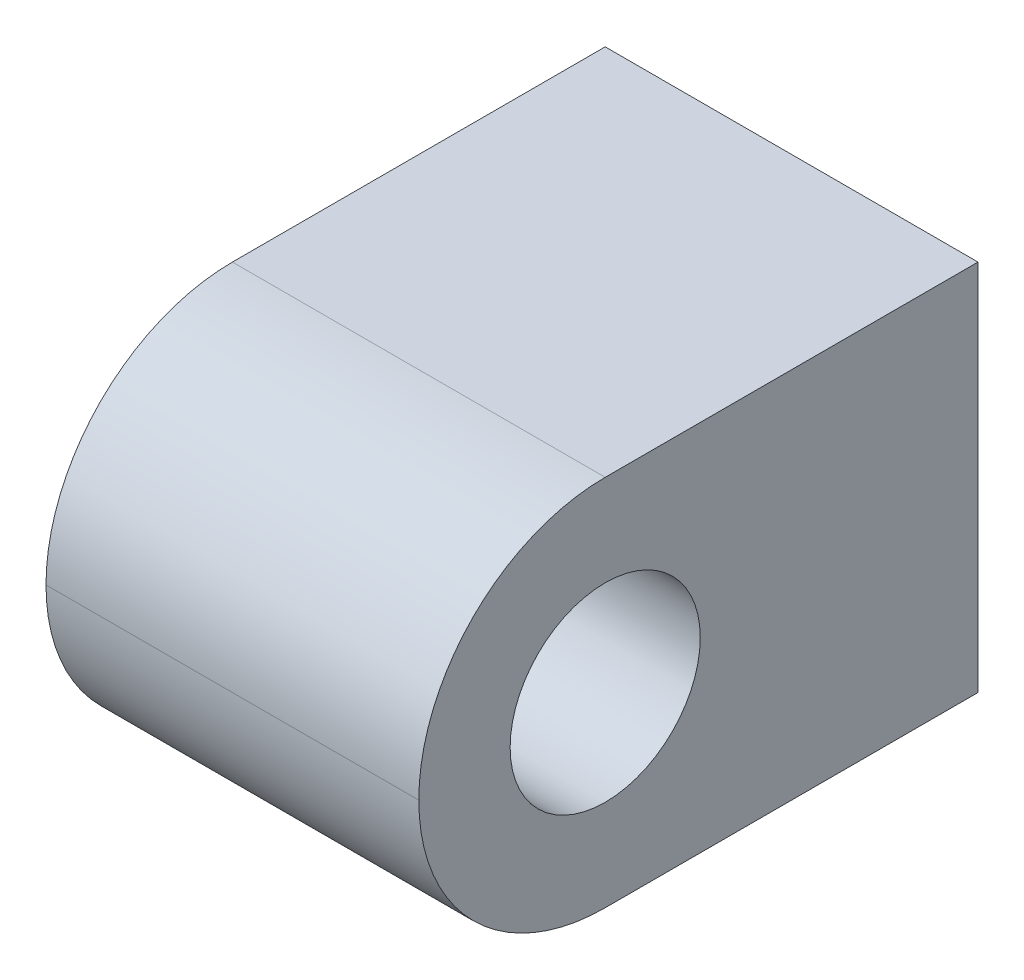
ISO-10303-21;
HEADER;
FILE_DESCRIPTION(('STEP AP214'),'2;1');
FILE_NAME('part.step','',(''),(''),'','','');
FILE_SCHEMA(('AUTOMOTIVE_DESIGN { 1 0 10303 214 1 1 1 1 }'));
ENDSEC;
DATA;
#1=APPLICATION_CONTEXT('core data for automotive mechanical design processes');
#2=APPLICATION_PROTOCOL_DEFINITION('international standard','automotive_design',2000,#1);
#3=PRODUCT_CONTEXT('',#1,'mechanical');
#4=PRODUCT('Part','Part','',(#3));
#5=PRODUCT_RELATED_PRODUCT_CATEGORY('part','',(#4));
#6=PRODUCT_DEFINITION_FORMATION('','',#4);
#7=PRODUCT_DEFINITION_CONTEXT('part definition',#1,'design');
#8=PRODUCT_DEFINITION('design','',#6,#7);
#9=PRODUCT_DEFINITION_SHAPE('','',#8);
#10=(LENGTH_UNIT() NAMED_UNIT(*) SI_UNIT(.MILLI.,.METRE.));
#11=(NAMED_UNIT(*) PLANE_ANGLE_UNIT() SI_UNIT($,.RADIAN.));
#12=(NAMED_UNIT(*) SI_UNIT($,.STERADIAN.) SOLID_ANGLE_UNIT());
#13=UNCERTAINTY_MEASURE_WITH_UNIT(LENGTH_MEASURE(1.E-05),#10,'distance_accuracy_value','');
#14=(GEOMETRIC_REPRESENTATION_CONTEXT(3) GLOBAL_UNCERTAINTY_ASSIGNED_CONTEXT((#13)) GLOBAL_UNIT_ASSIGNED_CONTEXT((#10,
#11,#12)) REPRESENTATION_CONTEXT('',''));
#15=CARTESIAN_POINT('',(0.,0.,0.));
#16=DIRECTION('',(0.,0.,1.));
#17=DIRECTION('',(1.,0.,0.));
#18=AXIS2_PLACEMENT_3D('',#15,#16,#17);
#19=CARTESIAN_POINT('',(0.,0.,0.));
#20=DIRECTION('',(0.,0.,1.));
#21=DIRECTION('',(1.,0.,0.));
#22=AXIS2_PLACEMENT_3D('',#19,#20,#21);
#23=PLANE('',#22);
#24=CARTESIAN_POINT('',(0.,0.,0.));
#25=DIRECTION('',(0.,0.,1.));
#26=DIRECTION('',(1.,0.,0.));
#27=AXIS2_PLACEMENT_3D('',#24,#25,#26);
#28=CIRCLE('',#27,2.475);
#29=CARTESIAN_POINT('',(2.475,0.,0.));
#30=VERTEX_POINT('',#29);
#31=EDGE_CURVE('E269',#30,#30,#28,.T.);
#32=ORIENTED_EDGE('',*,*,#31,.T.);
#33=EDGE_LOOP('',(#32));
#34=FACE_BOUND('',#33,.T.);
#35=DIRECTION('',(1.,0.,0.));
#36=VECTOR('',#35,1.);
#37=CARTESIAN_POINT('',(0.,-5.,0.));
#38=LINE('',#37,#36);
#39=CARTESIAN_POINT('',(-5.,-5.,0.));
#40=VERTEX_POINT('',#39);
#41=CARTESIAN_POINT('',(5.,-5.,0.));
#42=VERTEX_POINT('',#41);
#43=EDGE_CURVE('E156',#40,#42,#38,.T.);
#44=ORIENTED_EDGE('',*,*,#43,.F.);
#45=DIRECTION('',(0.,1.,0.));
#46=VECTOR('',#45,1.);
#47=CARTESIAN_POINT('',(-5.,0.,0.));
#48=LINE('',#47,#46);
#49=CARTESIAN_POINT('',(-5.,5.,0.));
#50=VERTEX_POINT('',#49);
#51=EDGE_CURVE('E171',#40,#50,#48,.T.);
#52=ORIENTED_EDGE('',*,*,#51,.T.);
#53=DIRECTION('',(1.,0.,0.));
#54=VECTOR('',#53,1.);
#55=CARTESIAN_POINT('',(0.,5.,0.));
#56=LINE('',#55,#54);
#57=CARTESIAN_POINT('',(5.,5.,0.));
#58=VERTEX_POINT('',#57);
#59=EDGE_CURVE('E159',#50,#58,#56,.T.);
#60=ORIENTED_EDGE('',*,*,#59,.T.);
#61=DIRECTION('',(0.,1.,0.));
#62=VECTOR('',#61,1.);
#63=CARTESIAN_POINT('',(5.,0.,0.));
#64=LINE('',#63,#62);
#65=EDGE_CURVE('E142',#42,#58,#64,.T.);
#66=ORIENTED_EDGE('',*,*,#65,.F.);
#67=EDGE_LOOP('',(#44,#52,#60,#66));
#68=FACE_BOUND('',#67,.T.);
#69=ADVANCED_FACE('F94',(#34,#68),#23,.F.);
#70=CARTESIAN_POINT('',(5.,0.,15.));
#71=DIRECTION('',(-1.,0.,0.));
#72=DIRECTION('',(0.,0.,1.));
#73=AXIS2_PLACEMENT_3D('',#70,#71,#72);
#74=PLANE('',#73);
#75=CARTESIAN_POINT('',(5.,0.,10.));
#76=DIRECTION('',(-1.,0.,0.));
#77=DIRECTION('',(0.,0.,1.));
#78=AXIS2_PLACEMENT_3D('',#75,#76,#77);
#79=CIRCLE('',#78,2.55);
#80=CARTESIAN_POINT('',(5.,0.,12.55));
#81=VERTEX_POINT('',#80);
#82=EDGE_CURVE('E163',#81,#81,#79,.T.);
#83=ORIENTED_EDGE('',*,*,#82,.T.);
#84=EDGE_LOOP('',(#83));
#85=FACE_BOUND('',#84,.T.);
#86=CARTESIAN_POINT('',(5.,0.,10.));
#87=DIRECTION('',(-1.,0.,0.));
#88=DIRECTION('',(0.,0.,1.));
#89=AXIS2_PLACEMENT_3D('',#86,#87,#88);
#90=CIRCLE('',#89,5.);
#91=CARTESIAN_POINT('',(5.,5.,10.));
#92=VERTEX_POINT('',#91);
#93=CARTESIAN_POINT('',(5.,0.,15.));
#94=VERTEX_POINT('',#93);
#95=EDGE_CURVE('E150',#92,#94,#90,.F.);
#96=ORIENTED_EDGE('',*,*,#95,.T.);
#97=CARTESIAN_POINT('',(5.,0.,10.));
#98=DIRECTION('',(-1.,0.,0.));
#99=DIRECTION('',(0.,0.,1.));
#100=AXIS2_PLACEMENT_3D('',#97,#98,#99);
#101=CIRCLE('',#100,5.);
#102=CARTESIAN_POINT('',(5.,-5.,10.));
#103=VERTEX_POINT('',#102);
#104=EDGE_CURVE('E145',#94,#103,#101,.F.);
#105=ORIENTED_EDGE('',*,*,#104,.T.);
#106=DIRECTION('',(0.,0.,-1.));
#107=VECTOR('',#106,1.);
#108=CARTESIAN_POINT('',(5.,-5.,15.));
#109=LINE('',#108,#107);
#110=EDGE_CURVE('E138',#103,#42,#109,.T.);
#111=ORIENTED_EDGE('',*,*,#110,.T.);
#112=ORIENTED_EDGE('',*,*,#65,.T.);
#113=DIRECTION('',(0.,0.,-1.));
#114=VECTOR('',#113,1.);
#115=CARTESIAN_POINT('',(5.,5.,15.));
#116=LINE('',#115,#114);
#117=EDGE_CURVE('E151',#92,#58,#116,.T.);
#118=ORIENTED_EDGE('',*,*,#117,.F.);
#119=EDGE_LOOP('',(#96,#105,#111,#112,#118));
#120=FACE_BOUND('',#119,.T.);
#121=ADVANCED_FACE('F140',(#85,#120),#74,.F.);
#122=CARTESIAN_POINT('',(0.,5.,15.));
#123=DIRECTION('',(0.,1.,0.));
#124=DIRECTION('',(0.,0.,1.));
#125=AXIS2_PLACEMENT_3D('',#122,#123,#124);
#126=PLANE('',#125);
#127=DIRECTION('',(0.,0.,-1.));
#128=VECTOR('',#127,1.);
#129=CARTESIAN_POINT('',(-5.,5.,15.));
#130=LINE('',#129,#128);
#131=CARTESIAN_POINT('',(-5.,5.,10.));
#132=VERTEX_POINT('',#131);
#133=EDGE_CURVE('E174',#132,#50,#130,.T.);
#134=ORIENTED_EDGE('',*,*,#133,.F.);
#135=DIRECTION('',(1.,0.,0.));
#136=VECTOR('',#135,1.);
#137=CARTESIAN_POINT('',(0.,5.,10.));
#138=LINE('',#137,#136);
#139=EDGE_CURVE('E12',#132,#92,#138,.T.);
#140=ORIENTED_EDGE('',*,*,#139,.T.);
#141=ORIENTED_EDGE('',*,*,#117,.T.);
#142=ORIENTED_EDGE('',*,*,#59,.F.);
#143=EDGE_LOOP('',(#134,#140,#141,#142));
#144=FACE_BOUND('',#143,.T.);
#145=ADVANCED_FACE('F186',(#144),#126,.T.);
#146=CARTESIAN_POINT('',(-5.,0.,15.));
#147=DIRECTION('',(-1.,0.,0.));
#148=DIRECTION('',(0.,0.,1.));
#149=AXIS2_PLACEMENT_3D('',#146,#147,#148);
#150=PLANE('',#149);
#151=CARTESIAN_POINT('',(-5.,0.,10.));
#152=DIRECTION('',(-1.,0.,0.));
#153=DIRECTION('',(0.,0.,1.));
#154=AXIS2_PLACEMENT_3D('',#151,#152,#153);
#155=CIRCLE('',#154,2.55);
#156=CARTESIAN_POINT('',(-5.,0.,12.55));
#157=VERTEX_POINT('',#156);
#158=EDGE_CURVE('E166',#157,#157,#155,.T.);
#159=ORIENTED_EDGE('',*,*,#158,.F.);
#160=EDGE_LOOP('',(#159));
#161=FACE_BOUND('',#160,.T.);
#162=DIRECTION('',(0.,0.,-1.));
#163=VECTOR('',#162,1.);
#164=CARTESIAN_POINT('',(-5.,-5.,15.));
#165=LINE('',#164,#163);
#166=CARTESIAN_POINT('',(-5.,-5.,10.));
#167=VERTEX_POINT('',#166);
#168=EDGE_CURVE('E162',#167,#40,#165,.T.);
#169=ORIENTED_EDGE('',*,*,#168,.F.);
#170=CARTESIAN_POINT('',(-5.,0.,10.));
#171=DIRECTION('',(-1.,0.,0.));
#172=DIRECTION('',(0.,0.,1.));
#173=AXIS2_PLACEMENT_3D('',#170,#171,#172);
#174=CIRCLE('',#173,5.);
#175=CARTESIAN_POINT('',(-5.,0.,15.));
#176=VERTEX_POINT('',#175);
#177=EDGE_CURVE('E103',#167,#176,#174,.T.);
#178=ORIENTED_EDGE('',*,*,#177,.T.);
#179=CARTESIAN_POINT('',(-5.,0.,10.));
#180=DIRECTION('',(-1.,0.,0.));
#181=DIRECTION('',(0.,0.,1.));
#182=AXIS2_PLACEMENT_3D('',#179,#180,#181);
#183=CIRCLE('',#182,5.);
#184=EDGE_CURVE('E110',#176,#132,#183,.T.);
#185=ORIENTED_EDGE('',*,*,#184,.T.);
#186=ORIENTED_EDGE('',*,*,#133,.T.);
#187=ORIENTED_EDGE('',*,*,#51,.F.);
#188=EDGE_LOOP('',(#169,#178,#185,#186,#187));
#189=FACE_BOUND('',#188,.T.);
#190=ADVANCED_FACE('F183',(#161,#189),#150,.T.);
#191=CARTESIAN_POINT('',(0.,-5.,15.));
#192=DIRECTION('',(0.,1.,0.));
#193=DIRECTION('',(0.,0.,1.));
#194=AXIS2_PLACEMENT_3D('',#191,#192,#193);
#195=PLANE('',#194);
#196=ORIENTED_EDGE('',*,*,#110,.F.);
#197=DIRECTION('',(1.,0.,0.));
#198=VECTOR('',#197,1.);
#199=CARTESIAN_POINT('',(-5.,-5.,10.));
#200=LINE('',#199,#198);
#201=EDGE_CURVE('E179',#103,#167,#200,.F.);
#202=ORIENTED_EDGE('',*,*,#201,.T.);
#203=ORIENTED_EDGE('',*,*,#168,.T.);
#204=ORIENTED_EDGE('',*,*,#43,.T.);
#205=EDGE_LOOP('',(#196,#202,#203,#204));
#206=FACE_BOUND('',#205,.T.);
#207=ADVANCED_FACE('F161',(#206),#195,.F.);
#208=CARTESIAN_POINT('',(5.,0.,10.));
#209=DIRECTION('',(-1.,0.,0.));
#210=DIRECTION('',(0.,0.,1.));
#211=AXIS2_PLACEMENT_3D('',#208,#209,#210);
#212=CYLINDRICAL_SURFACE('',#211,2.55);
#213=ORIENTED_EDGE('',*,*,#82,.F.);
#214=EDGE_LOOP('',(#213));
#215=FACE_BOUND('',#214,.T.);
#216=ORIENTED_EDGE('',*,*,#158,.T.);
#217=EDGE_LOOP('',(#216));
#218=FACE_BOUND('',#217,.T.);
#219=ADVANCED_FACE('F202',(#215,#218),#212,.F.);
#220=CARTESIAN_POINT('',(0.,0.,10.));
#221=DIRECTION('',(1.,0.,0.));
#222=DIRECTION('',(0.,0.,-1.));
#223=AXIS2_PLACEMENT_3D('',#220,#221,#222);
#224=CYLINDRICAL_SURFACE('',#223,5.);
#225=ORIENTED_EDGE('',*,*,#139,.F.);
#226=ORIENTED_EDGE('',*,*,#184,.F.);
#227=DIRECTION('',(1.,0.,0.));
#228=VECTOR('',#227,1.);
#229=CARTESIAN_POINT('',(0.,0.,15.));
#230=LINE('',#229,#228);
#231=EDGE_CURVE('E98',#94,#176,#230,.F.);
#232=ORIENTED_EDGE('',*,*,#231,.F.);
#233=ORIENTED_EDGE('',*,*,#95,.F.);
#234=EDGE_LOOP('',(#225,#226,#232,#233));
#235=FACE_BOUND('',#234,.T.);
#236=ADVANCED_FACE('F96',(#235),#224,.T.);
#237=CARTESIAN_POINT('',(0.,0.,10.));
#238=DIRECTION('',(-1.,0.,0.));
#239=DIRECTION('',(0.,0.,1.));
#240=AXIS2_PLACEMENT_3D('',#237,#238,#239);
#241=CYLINDRICAL_SURFACE('',#240,5.);
#242=ORIENTED_EDGE('',*,*,#177,.F.);
#243=ORIENTED_EDGE('',*,*,#201,.F.);
#244=ORIENTED_EDGE('',*,*,#104,.F.);
#245=ORIENTED_EDGE('',*,*,#231,.T.);
#246=EDGE_LOOP('',(#242,#243,#244,#245));
#247=FACE_BOUND('',#246,.T.);
#248=ADVANCED_FACE('F192',(#247),#241,.T.);
#249=CARTESIAN_POINT('',(0.,0.,7.));
#250=DIRECTION('',(0.,0.,-1.));
#251=DIRECTION('',(-1.,0.,0.));
#252=AXIS2_PLACEMENT_3D('',#249,#250,#251);
#253=CYLINDRICAL_SURFACE('',#252,2.475);
#254=CARTESIAN_POINT('',(0.,0.,7.));
#255=DIRECTION('',(0.,0.,1.));
#256=DIRECTION('',(1.,0.,0.));
#257=AXIS2_PLACEMENT_3D('',#254,#255,#256);
#258=CIRCLE('',#257,2.475);
#259=CARTESIAN_POINT('',(2.475,0.,7.));
#260=VERTEX_POINT('',#259);
#261=EDGE_CURVE('E191',#260,#260,#258,.T.);
#262=ORIENTED_EDGE('',*,*,#261,.T.);
#263=EDGE_LOOP('',(#262));
#264=FACE_BOUND('',#263,.T.);
#265=ORIENTED_EDGE('',*,*,#31,.F.);
#266=EDGE_LOOP('',(#265));
#267=FACE_BOUND('',#266,.T.);
#268=ADVANCED_FACE('F194',(#264,#267),#253,.F.);
#269=CARTESIAN_POINT('',(0.,0.,7.));
#270=DIRECTION('',(0.,0.,1.));
#271=DIRECTION('',(1.,0.,0.));
#272=AXIS2_PLACEMENT_3D('',#269,#270,#271);
#273=PLANE('',#272);
#274=ORIENTED_EDGE('',*,*,#261,.F.);
#275=EDGE_LOOP('',(#274));
#276=FACE_BOUND('',#275,.T.);
#277=ADVANCED_FACE('F199',(#276),#273,.F.);
#278=CLOSED_SHELL('',(#69,#121,#145,#190,#207,#219,#236,#248,#268,#277));
#279=MANIFOLD_SOLID_BREP('B2',#278);
#280=ADVANCED_BREP_SHAPE_REPRESENTATION('',(#18,#279),#14);
#281=SHAPE_DEFINITION_REPRESENTATION(#9,#280);
ENDSEC;
END-ISO-10303-21;
